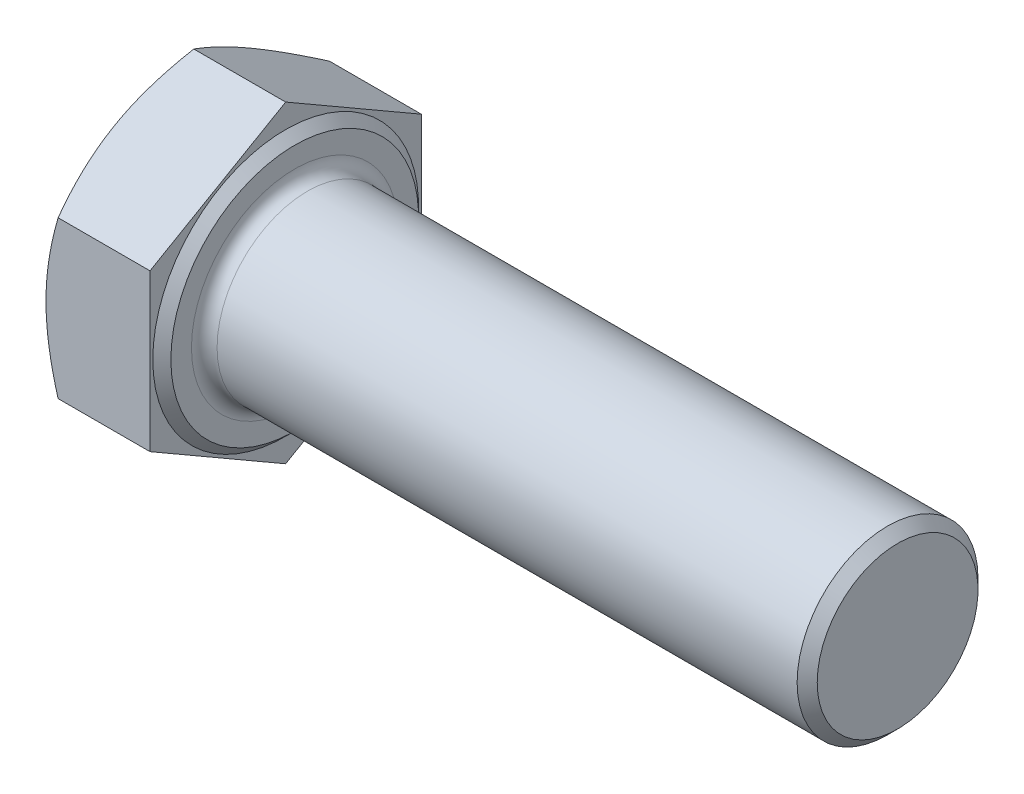
ISO-10303-21;
HEADER;
FILE_DESCRIPTION(('STEP AP214'),'2;1');
FILE_NAME('part.step','',(''),(''),'','','');
FILE_SCHEMA(('AUTOMOTIVE_DESIGN { 1 0 10303 214 1 1 1 1 }'));
ENDSEC;
DATA;
#1=APPLICATION_CONTEXT('core data for automotive mechanical design processes');
#2=APPLICATION_PROTOCOL_DEFINITION('international standard','automotive_design',2000,#1);
#3=PRODUCT_CONTEXT('',#1,'mechanical');
#4=PRODUCT('Part','Part','',(#3));
#5=PRODUCT_RELATED_PRODUCT_CATEGORY('part','',(#4));
#6=PRODUCT_DEFINITION_FORMATION('','',#4);
#7=PRODUCT_DEFINITION_CONTEXT('part definition',#1,'design');
#8=PRODUCT_DEFINITION('design','',#6,#7);
#9=PRODUCT_DEFINITION_SHAPE('','',#8);
#10=(LENGTH_UNIT() NAMED_UNIT(*) SI_UNIT(.MILLI.,.METRE.));
#11=(NAMED_UNIT(*) PLANE_ANGLE_UNIT() SI_UNIT($,.RADIAN.));
#12=(NAMED_UNIT(*) SI_UNIT($,.STERADIAN.) SOLID_ANGLE_UNIT());
#13=UNCERTAINTY_MEASURE_WITH_UNIT(LENGTH_MEASURE(1.E-05),#10,'distance_accuracy_value','');
#14=(GEOMETRIC_REPRESENTATION_CONTEXT(3) GLOBAL_UNCERTAINTY_ASSIGNED_CONTEXT((#13)) GLOBAL_UNIT_ASSIGNED_CONTEXT((#10,
#11,#12)) REPRESENTATION_CONTEXT('',''));
#15=CARTESIAN_POINT('',(0.,0.,0.));
#16=DIRECTION('',(0.,0.,1.));
#17=DIRECTION('',(1.,0.,0.));
#18=AXIS2_PLACEMENT_3D('',#15,#16,#17);
#19=CARTESIAN_POINT('',(7.5,5.19615242270662,-9.00000000000001));
#20=DIRECTION('',(1.,0.,0.));
#21=DIRECTION('',(0.,0.,-1.));
#22=AXIS2_PLACEMENT_3D('',#19,#20,#21);
#23=PLANE('',#22);
#24=CARTESIAN_POINT('',(7.5,0.,0.));
#25=DIRECTION('',(-1.,0.,0.));
#26=DIRECTION('',(0.,0.,1.));
#27=AXIS2_PLACEMENT_3D('',#24,#25,#26);
#28=CIRCLE('',#27,6.85);
#29=CARTESIAN_POINT('',(7.5,0.,6.85));
#30=VERTEX_POINT('',#29);
#31=EDGE_CURVE('E172',#30,#30,#28,.T.);
#32=ORIENTED_EDGE('',*,*,#31,.T.);
#33=EDGE_LOOP('',(#32));
#34=FACE_BOUND('',#33,.T.);
#35=CARTESIAN_POINT('',(7.5,0.,0.));
#36=DIRECTION('',(-1.,0.,0.));
#37=DIRECTION('',(0.,0.,1.));
#38=AXIS2_PLACEMENT_3D('',#35,#36,#37);
#39=CIRCLE('',#38,8.215);
#40=CARTESIAN_POINT('',(7.5,0.,8.215));
#41=VERTEX_POINT('',#40);
#42=EDGE_CURVE('E253',#41,#41,#39,.T.);
#43=ORIENTED_EDGE('',*,*,#42,.F.);
#44=EDGE_LOOP('',(#43));
#45=FACE_BOUND('',#44,.T.);
#46=ADVANCED_FACE('F36',(#34,#45),#23,.T.);
#47=CARTESIAN_POINT('',(8.35,0.,0.));
#48=DIRECTION('',(-1.,0.,0.));
#49=DIRECTION('',(0.,0.,1.));
#50=AXIS2_PLACEMENT_3D('',#47,#48,#49);
#51=TOROIDAL_SURFACE('',#50,6.85,0.85);
#52=ORIENTED_EDGE('',*,*,#31,.F.);
#53=EDGE_LOOP('',(#52));
#54=FACE_BOUND('',#53,.T.);
#55=CARTESIAN_POINT('',(8.35,0.,0.));
#56=DIRECTION('',(-1.,0.,0.));
#57=DIRECTION('',(0.,0.,1.));
#58=AXIS2_PLACEMENT_3D('',#55,#56,#57);
#59=CIRCLE('',#58,6.);
#60=CARTESIAN_POINT('',(8.35,0.,6.));
#61=VERTEX_POINT('',#60);
#62=EDGE_CURVE('E120',#61,#61,#59,.T.);
#63=ORIENTED_EDGE('',*,*,#62,.T.);
#64=EDGE_LOOP('',(#63));
#65=FACE_BOUND('',#64,.T.);
#66=ADVANCED_FACE('F207',(#54,#65),#51,.F.);
#67=CARTESIAN_POINT('',(47.5,6.,0.));
#68=DIRECTION('',(-1.,0.,0.));
#69=DIRECTION('',(0.,0.,1.));
#70=AXIS2_PLACEMENT_3D('',#67,#68,#69);
#71=PLANE('',#70);
#72=CARTESIAN_POINT('',(47.5,0.,0.));
#73=DIRECTION('',(-1.,0.,0.));
#74=DIRECTION('',(0.,0.,1.));
#75=AXIS2_PLACEMENT_3D('',#72,#73,#74);
#76=CIRCLE('',#75,5.33333333333333);
#77=CARTESIAN_POINT('',(47.5,0.,5.33333333333333));
#78=VERTEX_POINT('',#77);
#79=EDGE_CURVE('E44',#78,#78,#76,.F.);
#80=ORIENTED_EDGE('',*,*,#79,.T.);
#81=EDGE_LOOP('',(#80));
#82=FACE_BOUND('',#81,.T.);
#83=ADVANCED_FACE('F159',(#82),#71,.F.);
#84=CARTESIAN_POINT('',(7.50000000000001,0.,0.));
#85=DIRECTION('',(-1.,0.,0.));
#86=DIRECTION('',(0.,0.,1.));
#87=AXIS2_PLACEMENT_3D('',#84,#85,#86);
#88=CYLINDRICAL_SURFACE('',#87,6.);
#89=CARTESIAN_POINT('',(46.8333333333333,0.,0.));
#90=DIRECTION('',(-1.,0.,0.));
#91=DIRECTION('',(0.,0.,1.));
#92=AXIS2_PLACEMENT_3D('',#89,#90,#91);
#93=CIRCLE('',#92,6.);
#94=CARTESIAN_POINT('',(46.8333333333333,0.,6.));
#95=VERTEX_POINT('',#94);
#96=EDGE_CURVE('E154',#95,#95,#93,.T.);
#97=ORIENTED_EDGE('',*,*,#96,.T.);
#98=EDGE_LOOP('',(#97));
#99=FACE_BOUND('',#98,.T.);
#100=ORIENTED_EDGE('',*,*,#62,.F.);
#101=EDGE_LOOP('',(#100));
#102=FACE_BOUND('',#101,.T.);
#103=ADVANCED_FACE('F163',(#99,#102),#88,.T.);
#104=CARTESIAN_POINT('',(46.8333333333333,0.,0.));
#105=DIRECTION('',(-1.,0.,0.));
#106=DIRECTION('',(0.,0.,1.));
#107=AXIS2_PLACEMENT_3D('',#104,#105,#106);
#108=CONICAL_SURFACE('',#107,6.,0.785398163397448);
#109=ORIENTED_EDGE('',*,*,#79,.F.);
#110=EDGE_LOOP('',(#109));
#111=FACE_BOUND('',#110,.T.);
#112=ORIENTED_EDGE('',*,*,#96,.F.);
#113=EDGE_LOOP('',(#112));
#114=FACE_BOUND('',#113,.T.);
#115=ADVANCED_FACE('F38',(#111,#114),#108,.T.);
#116=CARTESIAN_POINT('',(6.9,-8.815,0.));
#117=DIRECTION('',(1.,0.,0.));
#118=DIRECTION('',(0.,0.,-1.));
#119=AXIS2_PLACEMENT_3D('',#116,#117,#118);
#120=PLANE('',#119);
#121=CARTESIAN_POINT('',(6.9,0.,0.));
#122=DIRECTION('',(-1.,0.,0.));
#123=DIRECTION('',(0.,0.,1.));
#124=AXIS2_PLACEMENT_3D('',#121,#122,#123);
#125=CIRCLE('',#124,8.815);
#126=CARTESIAN_POINT('',(6.9,0.,8.815));
#127=VERTEX_POINT('',#126);
#128=EDGE_CURVE('E255',#127,#127,#125,.T.);
#129=ORIENTED_EDGE('',*,*,#128,.T.);
#130=EDGE_LOOP('',(#129));
#131=FACE_BOUND('',#130,.T.);
#132=DIRECTION('',(0.,1.,0.));
#133=VECTOR('',#132,1.);
#134=CARTESIAN_POINT('',(6.9,-5.19615242270667,-9.00000000000001));
#135=LINE('',#134,#133);
#136=CARTESIAN_POINT('',(6.9,-5.19615242270667,-9.00000000000001));
#137=VERTEX_POINT('',#136);
#138=CARTESIAN_POINT('',(6.9,5.19615242270662,-9.00000000000001));
#139=VERTEX_POINT('',#138);
#140=EDGE_CURVE('E107',#137,#139,#135,.T.);
#141=ORIENTED_EDGE('',*,*,#140,.T.);
#142=DIRECTION('',(0.,0.500000000000001,0.866025403784438));
#143=VECTOR('',#142,1.);
#144=CARTESIAN_POINT('',(6.9,5.19615242270662,-9.00000000000001));
#145=LINE('',#144,#143);
#146=CARTESIAN_POINT('',(6.9,10.3923048454133,0.));
#147=VERTEX_POINT('',#146);
#148=EDGE_CURVE('E121',#139,#147,#145,.T.);
#149=ORIENTED_EDGE('',*,*,#148,.T.);
#150=DIRECTION('',(0.,-0.5,0.866025403784439));
#151=VECTOR('',#150,1.);
#152=CARTESIAN_POINT('',(6.9,10.3923048454133,0.));
#153=LINE('',#152,#151);
#154=CARTESIAN_POINT('',(6.9,5.19615242270664,9.00000000000001));
#155=VERTEX_POINT('',#154);
#156=EDGE_CURVE('E263',#147,#155,#153,.T.);
#157=ORIENTED_EDGE('',*,*,#156,.T.);
#158=DIRECTION('',(0.,-1.,0.));
#159=VECTOR('',#158,1.);
#160=CARTESIAN_POINT('',(6.9,5.19615242270664,9.00000000000001));
#161=LINE('',#160,#159);
#162=CARTESIAN_POINT('',(6.9,-5.19615242270665,9.00000000000001));
#163=VERTEX_POINT('',#162);
#164=EDGE_CURVE('E261',#155,#163,#161,.T.);
#165=ORIENTED_EDGE('',*,*,#164,.T.);
#166=DIRECTION('',(0.,-0.5,-0.866025403784439));
#167=VECTOR('',#166,1.);
#168=CARTESIAN_POINT('',(6.9,-5.19615242270665,9.00000000000001));
#169=LINE('',#168,#167);
#170=CARTESIAN_POINT('',(6.9,-10.3923048454133,0.));
#171=VERTEX_POINT('',#170);
#172=EDGE_CURVE('E50',#163,#171,#169,.T.);
#173=ORIENTED_EDGE('',*,*,#172,.T.);
#174=DIRECTION('',(0.,0.499999999999999,-0.866025403784439));
#175=VECTOR('',#174,1.);
#176=CARTESIAN_POINT('',(6.9,-10.3923048454133,0.));
#177=LINE('',#176,#175);
#178=EDGE_CURVE('E11',#171,#137,#177,.T.);
#179=ORIENTED_EDGE('',*,*,#178,.T.);
#180=EDGE_LOOP('',(#141,#149,#157,#165,#173,#179));
#181=FACE_BOUND('',#180,.T.);
#182=ADVANCED_FACE('F106',(#131,#181),#120,.T.);
#183=CARTESIAN_POINT('',(6.9,0.,0.));
#184=DIRECTION('',(-1.,0.,0.));
#185=DIRECTION('',(0.,0.,1.));
#186=AXIS2_PLACEMENT_3D('',#183,#184,#185);
#187=CONICAL_SURFACE('',#186,8.815,0.785398163397445);
#188=ORIENTED_EDGE('',*,*,#42,.T.);
#189=EDGE_LOOP('',(#188));
#190=FACE_BOUND('',#189,.T.);
#191=ORIENTED_EDGE('',*,*,#128,.F.);
#192=EDGE_LOOP('',(#191));
#193=FACE_BOUND('',#192,.T.);
#194=ADVANCED_FACE('F327',(#190,#193),#187,.T.);
#195=CARTESIAN_POINT('',(0.,5.19615242270662,-9.00000000000001));
#196=DIRECTION('',(1.,0.,0.));
#197=DIRECTION('',(0.,0.,-1.));
#198=AXIS2_PLACEMENT_3D('',#195,#196,#197);
#199=PLANE('',#198);
#200=CARTESIAN_POINT('',(0.,0.,0.));
#201=DIRECTION('',(1.,0.,0.));
#202=DIRECTION('',(0.,0.,-1.));
#203=AXIS2_PLACEMENT_3D('',#200,#201,#202);
#204=CIRCLE('',#203,9.);
#205=CARTESIAN_POINT('',(0.,0.,-9.));
#206=VERTEX_POINT('',#205);
#207=CARTESIAN_POINT('',(0.,7.79422863405995,-4.50000000000001));
#208=VERTEX_POINT('',#207);
#209=EDGE_CURVE('E153',#206,#208,#204,.T.);
#210=ORIENTED_EDGE('',*,*,#209,.F.);
#211=CARTESIAN_POINT('',(0.,-7.79422863405998,-4.50000000000001));
#212=VERTEX_POINT('',#211);
#213=EDGE_CURVE('E149',#212,#206,#204,.T.);
#214=ORIENTED_EDGE('',*,*,#213,.F.);
#215=CARTESIAN_POINT('',(0.,-7.79422863405995,4.5));
#216=VERTEX_POINT('',#215);
#217=EDGE_CURVE('E152',#216,#212,#204,.T.);
#218=ORIENTED_EDGE('',*,*,#217,.F.);
#219=CARTESIAN_POINT('',(0.,0.,9.));
#220=VERTEX_POINT('',#219);
#221=EDGE_CURVE('E292',#220,#216,#204,.T.);
#222=ORIENTED_EDGE('',*,*,#221,.F.);
#223=CARTESIAN_POINT('',(0.,0.,0.));
#224=DIRECTION('',(-1.,0.,0.));
#225=DIRECTION('',(0.,0.,1.));
#226=AXIS2_PLACEMENT_3D('',#223,#224,#225);
#227=CIRCLE('',#226,9.);
#228=CARTESIAN_POINT('',(0.,7.79422863405995,4.5));
#229=VERTEX_POINT('',#228);
#230=EDGE_CURVE('E175',#220,#229,#227,.T.);
#231=ORIENTED_EDGE('',*,*,#230,.T.);
#232=EDGE_CURVE('E329',#208,#229,#204,.T.);
#233=ORIENTED_EDGE('',*,*,#232,.F.);
#234=EDGE_LOOP('',(#210,#214,#218,#222,#231,#233));
#235=FACE_BOUND('',#234,.T.);
#236=ADVANCED_FACE('F321',(#235),#199,.F.);
#237=CARTESIAN_POINT('',(0.,0.,0.));
#238=DIRECTION('',(1.,0.,0.));
#239=DIRECTION('',(0.,0.,1.));
#240=AXIS2_PLACEMENT_3D('',#237,#238,#239);
#241=CONICAL_SURFACE('',#240,9.,1.0471975511966);
#242=CARTESIAN_POINT('',(0.803914245071134,10.3924203154671,0.000200000000000748));
#243=CARTESIAN_POINT('',(0.737982001874056,10.2782163639798,-0.197607046401217));
#244=CARTESIAN_POINT('',(0.675041409210313,10.1635669787649,-0.396185606649945));
#245=CARTESIAN_POINT('',(0.555968997655537,9.93333715083391,-0.79495536604421));
#246=CARTESIAN_POINT('',(0.499840117752063,9.81775632901308,-0.995147221818451));
#247=CARTESIAN_POINT('',(0.395151960728963,9.58544915100228,-1.3975150570961));
#248=CARTESIAN_POINT('',(0.346610772912786,9.46872074181186,-1.5996945925006));
#249=CARTESIAN_POINT('',(0.258148516787921,9.23447001335913,-2.00542875589075));
#250=CARTESIAN_POINT('',(0.218225687483275,9.11694786135375,-2.20898309417891));
#251=CARTESIAN_POINT('',(0.148684674147116,8.88408932604662,-2.61230590830692));
#252=CARTESIAN_POINT('',(0.1188375028478,8.76877014301847,-2.812044592399));
#253=CARTESIAN_POINT('',(0.0687933098590818,8.53761579013205,-3.212415675989));
#254=CARTESIAN_POINT('',(0.0485954355375401,8.42178066677662,-3.41304799494161));
#255=CARTESIAN_POINT('',(0.0183543473973479,8.18990950036672,-3.81466063597382));
#256=CARTESIAN_POINT('',(0.00829960958430425,8.07387383570154,-4.01564030266394));
#257=CARTESIAN_POINT('',(-0.0014376648549169,7.84169571742974,-4.41778459991642));
#258=CARTESIAN_POINT('',(-0.0011205219352435,7.72555326723328,-4.61894922457222));
#259=CARTESIAN_POINT('',(0.00916395215317316,7.50842142195782,-4.9950326125305));
#260=CARTESIAN_POINT('',(0.0178767400303971,7.40741671639994,-5.16997789436029));
#261=CARTESIAN_POINT('',(0.0429773400653699,7.20564389241818,-5.51945867708335));
#262=CARTESIAN_POINT('',(0.0593656695806695,7.10487579040239,-5.69399414955697));
#263=CARTESIAN_POINT('',(0.11965655623583,6.8029615939808,-6.21692487728551));
#264=CARTESIAN_POINT('',(0.174677482341129,6.60234990505054,-6.56439451510492));
#265=CARTESIAN_POINT('',(0.312230476325152,6.1989985076226,-7.26301962875401));
#266=CARTESIAN_POINT('',(0.395345618627108,5.99631027619253,-7.61408594368718));
#267=CARTESIAN_POINT('',(0.583982539436463,5.59395639760763,-8.31098330401862));
#268=CARTESIAN_POINT('',(0.689460012893358,5.39428559809852,-8.65682327355629));
#269=CARTESIAN_POINT('',(0.803914245071134,5.19603695265278,-9.00020000000002));
#270=B_SPLINE_CURVE_WITH_KNOTS('',3,(#242,#243,#244,#245,#246,#247,#248,#249,#250,#251,#252,
#253,#254,#255,#256,#257,#258,#259,#260,#261,#262,#263,#264,#265,#266,#267,#268,#269),
.UNSPECIFIED.,.F.,.F.,(4,2,2,2,2,2,2,2,2,2,2,2,2,4),(0.,0.713219249102578,1.42674513853509,
2.14194697262263,2.85700253034481,3.55449749123034,4.25193080859215,4.94857085059645,
5.64518936892663,6.25162976378285,6.85811104066342,8.07193747617895,9.31268391793543,
10.5509947443908),.UNSPECIFIED.);
#271=CARTESIAN_POINT('',(0.803847577293368,5.19615242270662,-9.00000000000001));
#272=VERTEX_POINT('',#271);
#273=EDGE_CURVE('E226',#208,#272,#270,.T.);
#274=ORIENTED_EDGE('',*,*,#273,.T.);
#275=CARTESIAN_POINT('',(4.3157074191982,-13.7995084316843,-9.));
#276=CARTESIAN_POINT('',(4.22013253439526,-13.6018679254426,-9.));
#277=CARTESIAN_POINT('',(4.12505080298443,-13.4039890546484,-9.));
#278=CARTESIAN_POINT('',(3.93598680428893,-13.0077042464045,-9.));
#279=CARTESIAN_POINT('',(3.84200454898896,-12.8092983032384,-9.));
#280=CARTESIAN_POINT('',(3.56184962780383,-12.2131565216176,-9.));
#281=CARTESIAN_POINT('',(3.37749981033902,-11.8145606598045,-9.00000000000001));
#282=CARTESIAN_POINT('',(3.01379661311235,-11.0123492685397,-9.00000000000001));
#283=CARTESIAN_POINT('',(2.8344776887473,-10.6087180782901,-9.00000000000001));
#284=CARTESIAN_POINT('',(2.48351230837535,-9.79814577003558,-9.00000000000001));
#285=CARTESIAN_POINT('',(2.31186545400594,-9.39120482518532,-9.00000000000001));
#286=CARTESIAN_POINT('',(1.9762152821863,-8.56822658898829,-9.00000000000001));
#287=CARTESIAN_POINT('',(1.81233420517801,-8.15213916672017,-9.00000000000001));
#288=CARTESIAN_POINT('',(1.49736059333087,-7.31506428892379,-9.00000000000001));
#289=CARTESIAN_POINT('',(1.3462694790236,-6.89407629499924,-9.00000000000001));
#290=CARTESIAN_POINT('',(1.06092289616766,-6.04738374465275,-9.00000000000001));
#291=CARTESIAN_POINT('',(0.926631795715649,-5.62169132879654,-9.00000000000001));
#292=CARTESIAN_POINT('',(0.679232315760683,-4.76426914600716,-9.00000000000001));
#293=CARTESIAN_POINT('',(0.566117256449574,-4.33254132922887,-9.00000000000001));
#294=CARTESIAN_POINT('',(0.366559377115363,-3.46268902797104,-9.00000000000001));
#295=CARTESIAN_POINT('',(0.280122671254115,-3.02456310122821,-9.00000000000001));
#296=CARTESIAN_POINT('',(0.174793560541782,-2.36350316664865,-9.00000000000001));
#297=CARTESIAN_POINT('',(0.143735891512435,-2.14247764841096,-9.00000000000001));
#298=CARTESIAN_POINT('',(0.0903399537533509,-1.69938384805887,-9.00000000000001));
#299=CARTESIAN_POINT('',(0.0680008209790058,-1.47731567148507,-9.00000000000001));
#300=CARTESIAN_POINT('',(0.0326440618616337,-1.03385615589218,-9.00000000000001));
#301=CARTESIAN_POINT('',(0.0195680807765648,-0.812469488475633,-9.00000000000001));
#302=CARTESIAN_POINT('',(0.00280703600105557,-0.369341048257121,-9.00000000000001));
#303=CARTESIAN_POINT('',(-0.000878151660751399,-0.147599280181647,-9.00000000000001));
#304=CARTESIAN_POINT('',(0.00123027624060716,0.295777195751507,-9.00000000000001));
#305=CARTESIAN_POINT('',(0.00702120862283877,0.517411916146251,-9.00000000000001));
#306=CARTESIAN_POINT('',(0.027937345948715,0.960243673240963,-9.00000000000001));
#307=CARTESIAN_POINT('',(0.0430630239651761,1.18144068718854,-9.00000000000001));
#308=CARTESIAN_POINT('',(0.0906660893200386,1.71695975867394,-9.00000000000001));
#309=CARTESIAN_POINT('',(0.127787316423487,2.0308758167705,-9.00000000000001));
#310=CARTESIAN_POINT('',(0.218774280130696,2.6563149667132,-9.00000000000001));
#311=CARTESIAN_POINT('',(0.272644573172931,2.96783738373058,-9.00000000000001));
#312=CARTESIAN_POINT('',(0.395219259557939,3.58822803653578,-9.00000000000001));
#313=CARTESIAN_POINT('',(0.463937632650046,3.89709348380463,-9.00000000000001));
#314=CARTESIAN_POINT('',(0.614110733174985,4.51165246111965,-9.00000000000001));
#315=CARTESIAN_POINT('',(0.69556426298213,4.81734628654834,-9.00000000000001));
#316=CARTESIAN_POINT('',(0.871394352716579,5.43311669104529,-9.00000000000001));
#317=CARTESIAN_POINT('',(0.966039586729744,5.74311602048119,-9.00000000000001));
#318=CARTESIAN_POINT('',(1.1647210228455,6.35983838148364,-9.00000000000001));
#319=CARTESIAN_POINT('',(1.26875076248434,6.66656350743331,-9.00000000000002));
#320=CARTESIAN_POINT('',(1.48404906939514,7.27550705154941,-9.00000000000002));
#321=CARTESIAN_POINT('',(1.59527366551665,7.57774111009036,-9.00000000000002));
#322=CARTESIAN_POINT('',(1.82427658147772,8.17986095918019,-9.00000000000002));
#323=CARTESIAN_POINT('',(1.94205753444496,8.47974575026465,-9.00000000000002));
#324=CARTESIAN_POINT('',(2.06246896276842,8.77853935760543,-9.00000000000002));
#325=B_SPLINE_CURVE_WITH_KNOTS('',3,(#275,#276,#277,#278,#279,#280,#281,#282,#283,#284,#285,
#286,#287,#288,#289,#290,#291,#292,#293,#294,#295,#296,#297,#298,#299,#300,#301,#302,#303,#304,
#305,#306,#307,#308,#309,#310,#311,#312,#313,#314,#315,#316,#317,#318,#319,#320,#321,#322,#323,
#324),.UNSPECIFIED.,.F.,.F.,(4,2,2,2,2,2,2,2,2,2,2,2,2,2,2,2,2,2,2,2,2,2,2,2,4),(0.,
0.65860859564293,1.31722436368957,2.63466903722827,3.959620579505,5.28450324524448,
6.62593322236619,7.96751199196909,9.30619528594504,10.6444555891149,11.9830223682758,
12.6524681090957,13.3218474880934,13.9869715718367,14.6520868749835,15.3170138820864,
15.9819745895962,16.929756693784,17.877796859826,18.8267335436614,19.7755810422467,
20.747776571344,21.719307653667,22.6853783589894,23.6518398914796),.UNSPECIFIED.);
#326=EDGE_CURVE('E281',#272,#206,#325,.F.);
#327=ORIENTED_EDGE('',*,*,#326,.T.);
#328=ORIENTED_EDGE('',*,*,#209,.T.);
#329=EDGE_LOOP('',(#274,#327,#328));
#330=FACE_BOUND('',#329,.T.);
#331=ADVANCED_FACE('F317',(#330),#241,.T.);
#332=CARTESIAN_POINT('',(0.803914245071135,5.1960369526528,9.0002));
#333=CARTESIAN_POINT('',(0.737982001874056,5.31024090414015,8.80239295359879));
#334=CARTESIAN_POINT('',(0.675041409210313,5.42489028935504,8.60381439335006));
#335=CARTESIAN_POINT('',(0.555968997655538,5.65512011728601,8.20504463395579));
#336=CARTESIAN_POINT('',(0.499840117752065,5.77070093910683,8.00485277818155));
#337=CARTESIAN_POINT('',(0.395151960728965,6.00300811711763,7.60248494290391));
#338=CARTESIAN_POINT('',(0.346610772912788,6.11973652630805,7.40030540749941));
#339=CARTESIAN_POINT('',(0.258148516787922,6.35398725476078,6.99457124410926));
#340=CARTESIAN_POINT('',(0.218225687483276,6.47150940676617,6.79101690582109));
#341=CARTESIAN_POINT('',(0.148684674147117,6.70436794207329,6.38769409169309));
#342=CARTESIAN_POINT('',(0.118837502847803,6.81968712510144,6.187955407601));
#343=CARTESIAN_POINT('',(0.0687933098590857,7.05084147798786,5.78758432401101));
#344=CARTESIAN_POINT('',(0.0485954355375437,7.16667660134329,5.58695200505839));
#345=CARTESIAN_POINT('',(0.0183543473973509,7.3985477677532,5.18533936402618));
#346=CARTESIAN_POINT('',(0.00829960958430697,7.51458343241838,4.98435969733606));
#347=CARTESIAN_POINT('',(-0.0014376648549136,7.74676155069017,4.58221540008358));
#348=CARTESIAN_POINT('',(-0.00112052193523936,7.86290400088663,4.38105077542778));
#349=CARTESIAN_POINT('',(0.00916395215317751,8.08003584616209,4.0049673874695));
#350=CARTESIAN_POINT('',(0.0178767400304009,8.18104055171997,3.83002210563971));
#351=CARTESIAN_POINT('',(0.0429773400653737,8.38281337570173,3.48054132291665));
#352=CARTESIAN_POINT('',(0.0593656695806736,8.48358147771751,3.30600585044303));
#353=CARTESIAN_POINT('',(0.119656556235835,8.78549567413911,2.7830751227145));
#354=CARTESIAN_POINT('',(0.174677482341133,8.98610736306937,2.43560548489509));
#355=CARTESIAN_POINT('',(0.312230476325155,9.3894587604973,1.736980371246));
#356=CARTESIAN_POINT('',(0.395345618627112,9.59214699192738,1.38591405631283));
#357=CARTESIAN_POINT('',(0.583982539436466,9.99450087051227,0.689016695981394));
#358=CARTESIAN_POINT('',(0.689460012893361,10.1941716700214,0.343176726443722));
#359=CARTESIAN_POINT('',(0.803914245071134,10.3924203154671,-0.000199999999999903));
#360=B_SPLINE_CURVE_WITH_KNOTS('',3,(#332,#333,#334,#335,#336,#337,#338,#339,#340,#341,#342,
#343,#344,#345,#346,#347,#348,#349,#350,#351,#352,#353,#354,#355,#356,#357,#358,#359),
.UNSPECIFIED.,.F.,.F.,(4,2,2,2,2,2,2,2,2,2,2,2,2,4),(0.,0.713219249102579,1.42674513853509,
2.14194697262263,2.85700253034481,3.55449749123034,4.25193080859215,4.94857085059646,
5.64518936892663,6.25162976378284,6.85811104066341,8.07193747617894,9.31268391793542,
10.5509947443908),.UNSPECIFIED.);
#361=CARTESIAN_POINT('',(0.803847577293369,10.3923048454133,0.));
#362=VERTEX_POINT('',#361);
#363=EDGE_CURVE('E133',#229,#362,#360,.T.);
#364=ORIENTED_EDGE('',*,*,#363,.T.);
#365=EDGE_CURVE('E58',#362,#208,#270,.T.);
#366=ORIENTED_EDGE('',*,*,#365,.T.);
#367=ORIENTED_EDGE('',*,*,#232,.T.);
#368=EDGE_LOOP('',(#364,#366,#367));
#369=FACE_BOUND('',#368,.T.);
#370=ADVANCED_FACE('F204',(#369),#241,.T.);
#371=CARTESIAN_POINT('',(0.803847577293369,5.19615242270664,9.00000000000001));
#372=VERTEX_POINT('',#371);
#373=EDGE_CURVE('E129',#372,#229,#360,.T.);
#374=ORIENTED_EDGE('',*,*,#373,.T.);
#375=ORIENTED_EDGE('',*,*,#230,.F.);
#376=CARTESIAN_POINT('',(4.3157074191982,-13.7995084316843,9.00000000000002));
#377=CARTESIAN_POINT('',(4.22013253439526,-13.6018679254426,9.00000000000002));
#378=CARTESIAN_POINT('',(4.12505080298442,-13.4039890546484,9.00000000000002));
#379=CARTESIAN_POINT('',(3.93598680428892,-13.0077042464044,9.00000000000002));
#380=CARTESIAN_POINT('',(3.84200454898896,-12.8092983032384,9.00000000000002));
#381=CARTESIAN_POINT('',(3.56184962780383,-12.2131565216176,9.00000000000002));
#382=CARTESIAN_POINT('',(3.37749981033902,-11.8145606598044,9.00000000000002));
#383=CARTESIAN_POINT('',(3.01379661311234,-11.0123492685397,9.00000000000002));
#384=CARTESIAN_POINT('',(2.8344776887473,-10.6087180782901,9.00000000000002));
#385=CARTESIAN_POINT('',(2.48351230837535,-9.79814577003556,9.00000000000002));
#386=CARTESIAN_POINT('',(2.31186545400594,-9.3912048251853,9.00000000000002));
#387=CARTESIAN_POINT('',(1.97621528218629,-8.56822658898827,9.00000000000002));
#388=CARTESIAN_POINT('',(1.81233420517801,-8.15213916672015,9.00000000000002));
#389=CARTESIAN_POINT('',(1.49736059333087,-7.31506428892377,9.00000000000002));
#390=CARTESIAN_POINT('',(1.3462694790236,-6.89407629499922,9.00000000000002));
#391=CARTESIAN_POINT('',(1.06092289616766,-6.04738374465273,9.00000000000002));
#392=CARTESIAN_POINT('',(0.926631795715647,-5.62169132879652,9.00000000000001));
#393=CARTESIAN_POINT('',(0.679232315760681,-4.76426914600714,9.00000000000001));
#394=CARTESIAN_POINT('',(0.566117256449572,-4.33254132922885,9.00000000000001));
#395=CARTESIAN_POINT('',(0.366559377115361,-3.46268902797102,9.00000000000001));
#396=CARTESIAN_POINT('',(0.280122671254114,-3.02456310122819,9.00000000000001));
#397=CARTESIAN_POINT('',(0.174793560541781,-2.36350316664863,9.00000000000001));
#398=CARTESIAN_POINT('',(0.143735891512434,-2.14247764841094,9.00000000000001));
#399=CARTESIAN_POINT('',(0.0903399537533499,-1.69938384805885,9.00000000000001));
#400=CARTESIAN_POINT('',(0.0680008209790052,-1.47731567148505,9.00000000000001));
#401=CARTESIAN_POINT('',(0.0326440618616327,-1.03385615589217,9.00000000000001));
#402=CARTESIAN_POINT('',(0.0195680807765631,-0.812469488475614,9.00000000000001));
#403=CARTESIAN_POINT('',(0.00280703600105437,-0.369341048257102,9.00000000000001));
#404=CARTESIAN_POINT('',(-0.000878151660751392,-0.147599280181627,9.00000000000001));
#405=CARTESIAN_POINT('',(0.00123027624060701,0.295777195751527,9.00000000000001));
#406=CARTESIAN_POINT('',(0.00702120862283722,0.517411916146271,9.00000000000001));
#407=CARTESIAN_POINT('',(0.0279373459487131,0.960243673240983,9.00000000000001));
#408=CARTESIAN_POINT('',(0.0430630239651753,1.18144068718856,9.00000000000001));
#409=CARTESIAN_POINT('',(0.0906660893200389,1.71695975867396,9.00000000000001));
#410=CARTESIAN_POINT('',(0.127787316423487,2.03087581677052,9.00000000000001));
#411=CARTESIAN_POINT('',(0.218774280130696,2.65631496671322,9.00000000000001));
#412=CARTESIAN_POINT('',(0.272644573172931,2.9678373837306,9.00000000000001));
#413=CARTESIAN_POINT('',(0.395219259557939,3.5882280365358,9.00000000000001));
#414=CARTESIAN_POINT('',(0.463937632650046,3.89709348380465,9.00000000000001));
#415=CARTESIAN_POINT('',(0.614110733174985,4.51165246111967,9.00000000000001));
#416=CARTESIAN_POINT('',(0.695564262982131,4.81734628654836,9.00000000000001));
#417=CARTESIAN_POINT('',(0.87139435271658,5.43311669104531,9.00000000000001));
#418=CARTESIAN_POINT('',(0.966039586729744,5.74311602048121,9.00000000000001));
#419=CARTESIAN_POINT('',(1.1647210228455,6.35983838148366,9.00000000000001));
#420=CARTESIAN_POINT('',(1.26875076248434,6.66656350743333,9.));
#421=CARTESIAN_POINT('',(1.48404906939514,7.27550705154943,9.));
#422=CARTESIAN_POINT('',(1.59527366551665,7.57774111009038,9.));
#423=CARTESIAN_POINT('',(1.82427658147773,8.17986095918021,9.));
#424=CARTESIAN_POINT('',(1.94205753444496,8.47974575026467,9.));
#425=CARTESIAN_POINT('',(2.06246896276842,8.77853935760545,9.));
#426=B_SPLINE_CURVE_WITH_KNOTS('',3,(#376,#377,#378,#379,#380,#381,#382,#383,#384,#385,#386,
#387,#388,#389,#390,#391,#392,#393,#394,#395,#396,#397,#398,#399,#400,#401,#402,#403,#404,#405,
#406,#407,#408,#409,#410,#411,#412,#413,#414,#415,#416,#417,#418,#419,#420,#421,#422,#423,#424,
#425),.UNSPECIFIED.,.F.,.F.,(4,2,2,2,2,2,2,2,2,2,2,2,2,2,2,2,2,2,2,2,2,2,2,2,4),(0.,
0.658608595642928,1.31722436368956,2.63466903722827,3.959620579505,5.28450324524448,
6.6259332223662,7.96751199196909,9.30619528594504,10.6444555891149,11.9830223682758,
12.6524681090957,13.3218474880934,13.9869715718367,14.6520868749835,15.3170138820864,
15.9819745895962,16.929756693784,17.877796859826,18.8267335436614,19.7755810422467,
20.747776571344,21.719307653667,22.6853783589894,23.6518398914796),.UNSPECIFIED.);
#427=EDGE_CURVE('E272',#220,#372,#426,.T.);
#428=ORIENTED_EDGE('',*,*,#427,.T.);
#429=EDGE_LOOP('',(#374,#375,#428));
#430=FACE_BOUND('',#429,.T.);
#431=ADVANCED_FACE('F198',(#430),#241,.T.);
#432=CARTESIAN_POINT('',(0.803847577293375,-5.19615242270665,9.00000000000001));
#433=VERTEX_POINT('',#432);
#434=EDGE_CURVE('E220',#433,#220,#426,.T.);
#435=ORIENTED_EDGE('',*,*,#434,.T.);
#436=ORIENTED_EDGE('',*,*,#221,.T.);
#437=CARTESIAN_POINT('',(0.803914245071145,-10.3924203154671,-0.000199999999998842));
#438=CARTESIAN_POINT('',(0.737982001874067,-10.2782163639798,0.197607046401218));
#439=CARTESIAN_POINT('',(0.675041409210325,-10.1635669787649,0.396185606649946));
#440=CARTESIAN_POINT('',(0.555968997655549,-9.93333715083393,0.794955366044212));
#441=CARTESIAN_POINT('',(0.499840117752075,-9.8177563290131,0.995147221818453));
#442=CARTESIAN_POINT('',(0.395151960728974,-9.5854491510023,1.3975150570961));
#443=CARTESIAN_POINT('',(0.346610772912797,-9.46872074181188,1.5996945925006));
#444=CARTESIAN_POINT('',(0.258148516787931,-9.23447001335915,2.00542875589075));
#445=CARTESIAN_POINT('',(0.218225687483285,-9.11694786135376,2.20898309417892));
#446=CARTESIAN_POINT('',(0.148684674147126,-8.88408932604664,2.61230590830692));
#447=CARTESIAN_POINT('',(0.118837502847811,-8.76877014301849,2.81204459239901));
#448=CARTESIAN_POINT('',(0.0687933098590938,-8.53761579013207,3.212415675989));
#449=CARTESIAN_POINT('',(0.0485954355375522,-8.42178066677664,3.41304799494162));
#450=CARTESIAN_POINT('',(0.0183543473973594,-8.18990950036673,3.81466063597383));
#451=CARTESIAN_POINT('',(0.00829960958431508,-8.07387383570155,4.01564030266395));
#452=CARTESIAN_POINT('',(-0.00143766485490569,-7.84169571742975,4.41778459991644));
#453=CARTESIAN_POINT('',(-0.00112052193523125,-7.7255532672333,4.61894922457224));
#454=CARTESIAN_POINT('',(0.00916395215318543,-7.50842142195784,4.99503261253052));
#455=CARTESIAN_POINT('',(0.0178767400304085,-7.40741671639995,5.16997789436031));
#456=CARTESIAN_POINT('',(0.0429773400653816,-7.2056438924182,5.51945867708336));
#457=CARTESIAN_POINT('',(0.0593656695806821,-7.10487579040241,5.69399414955699));
#458=CARTESIAN_POINT('',(0.119656556235844,-6.80296159398081,6.21692487728552));
#459=CARTESIAN_POINT('',(0.174677482341141,-6.60234990505056,6.56439451510493));
#460=CARTESIAN_POINT('',(0.312230476325162,-6.19899850762262,7.26301962875401));
#461=CARTESIAN_POINT('',(0.395345618627119,-5.99631027619255,7.61408594368719));
#462=CARTESIAN_POINT('',(0.583982539436473,-5.59395639760765,8.31098330401862));
#463=CARTESIAN_POINT('',(0.689460012893368,-5.39428559809855,8.65682327355629));
#464=CARTESIAN_POINT('',(0.803914245071142,-5.19603695265281,9.00020000000002));
#465=B_SPLINE_CURVE_WITH_KNOTS('',3,(#437,#438,#439,#440,#441,#442,#443,#444,#445,#446,#447,
#448,#449,#450,#451,#452,#453,#454,#455,#456,#457,#458,#459,#460,#461,#462,#463,#464),
.UNSPECIFIED.,.F.,.F.,(4,2,2,2,2,2,2,2,2,2,2,2,2,4),(0.,0.713219249102579,1.42674513853509,
2.14194697262263,2.85700253034481,3.55449749123035,4.25193080859216,4.94857085059647,
5.64518936892664,6.25162976378285,6.85811104066342,8.07193747617896,9.31268391793543,
10.5509947443908),.UNSPECIFIED.);
#466=EDGE_CURVE('E276',#216,#433,#465,.T.);
#467=ORIENTED_EDGE('',*,*,#466,.T.);
#468=EDGE_LOOP('',(#435,#436,#467));
#469=FACE_BOUND('',#468,.T.);
#470=ADVANCED_FACE('F203',(#469),#241,.T.);
#471=CARTESIAN_POINT('',(0.803847577293378,-5.19615242270667,-9.00000000000001));
#472=VERTEX_POINT('',#471);
#473=EDGE_CURVE('E214',#206,#472,#325,.F.);
#474=ORIENTED_EDGE('',*,*,#473,.T.);
#475=CARTESIAN_POINT('',(0.803914245071145,-5.19603695265283,-9.00020000000001));
#476=CARTESIAN_POINT('',(0.737982001874065,-5.31024090414018,-8.80239295359879));
#477=CARTESIAN_POINT('',(0.675041409210323,-5.42489028935507,-8.60381439335006));
#478=CARTESIAN_POINT('',(0.555968997655548,-5.65512011728603,-8.2050446339558));
#479=CARTESIAN_POINT('',(0.499840117752075,-5.77070093910686,-8.00485277818155));
#480=CARTESIAN_POINT('',(0.395151960728975,-6.00300811711766,-7.60248494290391));
#481=CARTESIAN_POINT('',(0.346610772912799,-6.11973652630808,-7.40030540749941));
#482=CARTESIAN_POINT('',(0.258148516787933,-6.35398725476081,-6.99457124410925));
#483=CARTESIAN_POINT('',(0.218225687483287,-6.4715094067662,-6.79101690582109));
#484=CARTESIAN_POINT('',(0.148684674147128,-6.70436794207332,-6.38769409169308));
#485=CARTESIAN_POINT('',(0.118837502847814,-6.81968712510147,-6.18795540760099));
#486=CARTESIAN_POINT('',(0.0687933098590958,-7.05084147798789,-5.787584324011));
#487=CARTESIAN_POINT('',(0.048595435537554,-7.16667660134332,-5.58695200505839));
#488=CARTESIAN_POINT('',(0.0183543473973617,-7.39854776775323,-5.18533936402618));
#489=CARTESIAN_POINT('',(0.00829960958431812,-7.51458343241841,-4.98435969733606));
#490=CARTESIAN_POINT('',(-0.00143766485490172,-7.7467615506902,-4.58221540008357));
#491=CARTESIAN_POINT('',(-0.00112052193522714,-7.86290400088666,-4.38105077542777));
#492=CARTESIAN_POINT('',(0.00916395215319027,-8.08003584616212,-4.00496738746949));
#493=CARTESIAN_POINT('',(0.0178767400304139,-8.18104055172,-3.8300221056397));
#494=CARTESIAN_POINT('',(0.0429773400653869,-8.38281337570176,-3.48054132291665));
#495=CARTESIAN_POINT('',(0.059365669580687,-8.48358147771754,-3.30600585044302));
#496=CARTESIAN_POINT('',(0.119656556235848,-8.78549567413913,-2.78307512271449));
#497=CARTESIAN_POINT('',(0.174677482341146,-8.98610736306939,-2.43560548489508));
#498=CARTESIAN_POINT('',(0.312230476325168,-9.38945876049732,-1.73698037124599));
#499=CARTESIAN_POINT('',(0.395345618627124,-9.5921469919274,-1.38591405631282));
#500=CARTESIAN_POINT('',(0.583982539436477,-9.99450087051229,-0.689016695981392));
#501=CARTESIAN_POINT('',(0.689460012893372,-10.1941716700214,-0.34317672644372));
#502=CARTESIAN_POINT('',(0.803914245071146,-10.3924203154671,0.000200000000001538));
#503=B_SPLINE_CURVE_WITH_KNOTS('',3,(#475,#476,#477,#478,#479,#480,#481,#482,#483,#484,#485,
#486,#487,#488,#489,#490,#491,#492,#493,#494,#495,#496,#497,#498,#499,#500,#501,#502),
.UNSPECIFIED.,.F.,.F.,(4,2,2,2,2,2,2,2,2,2,2,2,2,4),(0.,0.71321924910258,1.42674513853509,
2.14194697262264,2.85700253034481,3.55449749123035,4.25193080859216,4.94857085059647,
5.64518936892664,6.25162976378285,6.85811104066342,8.07193747617895,9.31268391793542,
10.5509947443908),.UNSPECIFIED.);
#504=EDGE_CURVE('E127',#472,#212,#503,.T.);
#505=ORIENTED_EDGE('',*,*,#504,.T.);
#506=ORIENTED_EDGE('',*,*,#213,.T.);
#507=EDGE_LOOP('',(#474,#505,#506));
#508=FACE_BOUND('',#507,.T.);
#509=ADVANCED_FACE('F287',(#508),#241,.T.);
#510=CARTESIAN_POINT('',(0.80384757729338,-10.3923048454133,0.));
#511=VERTEX_POINT('',#510);
#512=EDGE_CURVE('E189',#511,#216,#465,.T.);
#513=ORIENTED_EDGE('',*,*,#512,.T.);
#514=ORIENTED_EDGE('',*,*,#217,.T.);
#515=EDGE_CURVE('E181',#212,#511,#503,.T.);
#516=ORIENTED_EDGE('',*,*,#515,.T.);
#517=EDGE_LOOP('',(#513,#514,#516));
#518=FACE_BOUND('',#517,.T.);
#519=ADVANCED_FACE('F206',(#518),#241,.T.);
#520=CARTESIAN_POINT('',(7.5,-10.3923048454133,0.));
#521=DIRECTION('',(0.,0.866025403784439,0.499999999999999));
#522=DIRECTION('',(0.,-0.499999999999999,0.866025403784439));
#523=AXIS2_PLACEMENT_3D('',#520,#521,#522);
#524=PLANE('',#523);
#525=ORIENTED_EDGE('',*,*,#178,.F.);
#526=DIRECTION('',(-1.,0.,0.));
#527=VECTOR('',#526,1.);
#528=CARTESIAN_POINT('',(7.5,-10.3923048454133,0.));
#529=LINE('',#528,#527);
#530=EDGE_CURVE('E128',#171,#511,#529,.T.);
#531=ORIENTED_EDGE('',*,*,#530,.T.);
#532=ORIENTED_EDGE('',*,*,#515,.F.);
#533=ORIENTED_EDGE('',*,*,#504,.F.);
#534=DIRECTION('',(-1.,0.,0.));
#535=VECTOR('',#534,1.);
#536=CARTESIAN_POINT('',(7.5,-5.19615242270667,-9.00000000000001));
#537=LINE('',#536,#535);
#538=EDGE_CURVE('E116',#137,#472,#537,.T.);
#539=ORIENTED_EDGE('',*,*,#538,.F.);
#540=EDGE_LOOP('',(#525,#531,#532,#533,#539));
#541=FACE_BOUND('',#540,.T.);
#542=ADVANCED_FACE('F124',(#541),#524,.F.);
#543=CARTESIAN_POINT('',(7.5,-5.19615242270665,9.00000000000001));
#544=DIRECTION('',(0.,0.866025403784439,-0.5));
#545=DIRECTION('',(0.,0.5,0.866025403784439));
#546=AXIS2_PLACEMENT_3D('',#543,#544,#545);
#547=PLANE('',#546);
#548=ORIENTED_EDGE('',*,*,#172,.F.);
#549=DIRECTION('',(-1.,0.,0.));
#550=VECTOR('',#549,1.);
#551=CARTESIAN_POINT('',(7.5,-5.19615242270665,9.00000000000001));
#552=LINE('',#551,#550);
#553=EDGE_CURVE('E131',#163,#433,#552,.T.);
#554=ORIENTED_EDGE('',*,*,#553,.T.);
#555=ORIENTED_EDGE('',*,*,#466,.F.);
#556=ORIENTED_EDGE('',*,*,#512,.F.);
#557=ORIENTED_EDGE('',*,*,#530,.F.);
#558=EDGE_LOOP('',(#548,#554,#555,#556,#557));
#559=FACE_BOUND('',#558,.T.);
#560=ADVANCED_FACE('F294',(#559),#547,.F.);
#561=CARTESIAN_POINT('',(7.5,5.19615242270664,9.00000000000001));
#562=DIRECTION('',(0.,0.,-1.));
#563=DIRECTION('',(0.,1.,0.));
#564=AXIS2_PLACEMENT_3D('',#561,#562,#563);
#565=PLANE('',#564);
#566=ORIENTED_EDGE('',*,*,#164,.F.);
#567=DIRECTION('',(-1.,0.,0.));
#568=VECTOR('',#567,1.);
#569=CARTESIAN_POINT('',(7.5,5.19615242270664,9.00000000000001));
#570=LINE('',#569,#568);
#571=EDGE_CURVE('E144',#155,#372,#570,.T.);
#572=ORIENTED_EDGE('',*,*,#571,.T.);
#573=ORIENTED_EDGE('',*,*,#427,.F.);
#574=ORIENTED_EDGE('',*,*,#434,.F.);
#575=ORIENTED_EDGE('',*,*,#553,.F.);
#576=EDGE_LOOP('',(#566,#572,#573,#574,#575));
#577=FACE_BOUND('',#576,.T.);
#578=ADVANCED_FACE('F297',(#577),#565,.F.);
#579=CARTESIAN_POINT('',(7.5,10.3923048454133,0.));
#580=DIRECTION('',(0.,-0.866025403784439,-0.5));
#581=DIRECTION('',(0.,0.5,-0.866025403784439));
#582=AXIS2_PLACEMENT_3D('',#579,#580,#581);
#583=PLANE('',#582);
#584=ORIENTED_EDGE('',*,*,#156,.F.);
#585=DIRECTION('',(-1.,0.,0.));
#586=VECTOR('',#585,1.);
#587=CARTESIAN_POINT('',(7.5,10.3923048454133,0.));
#588=LINE('',#587,#586);
#589=EDGE_CURVE('E146',#147,#362,#588,.T.);
#590=ORIENTED_EDGE('',*,*,#589,.T.);
#591=ORIENTED_EDGE('',*,*,#363,.F.);
#592=ORIENTED_EDGE('',*,*,#373,.F.);
#593=ORIENTED_EDGE('',*,*,#571,.F.);
#594=EDGE_LOOP('',(#584,#590,#591,#592,#593));
#595=FACE_BOUND('',#594,.T.);
#596=ADVANCED_FACE('F236',(#595),#583,.F.);
#597=CARTESIAN_POINT('',(7.5,5.19615242270662,-9.00000000000001));
#598=DIRECTION('',(0.,-0.866025403784438,0.500000000000001));
#599=DIRECTION('',(0.,-0.500000000000001,-0.866025403784438));
#600=AXIS2_PLACEMENT_3D('',#597,#598,#599);
#601=PLANE('',#600);
#602=ORIENTED_EDGE('',*,*,#148,.F.);
#603=DIRECTION('',(-1.,0.,0.));
#604=VECTOR('',#603,1.);
#605=CARTESIAN_POINT('',(7.5,5.19615242270662,-9.00000000000001));
#606=LINE('',#605,#604);
#607=EDGE_CURVE('E119',#139,#272,#606,.T.);
#608=ORIENTED_EDGE('',*,*,#607,.T.);
#609=ORIENTED_EDGE('',*,*,#273,.F.);
#610=ORIENTED_EDGE('',*,*,#365,.F.);
#611=ORIENTED_EDGE('',*,*,#589,.F.);
#612=EDGE_LOOP('',(#602,#608,#609,#610,#611));
#613=FACE_BOUND('',#612,.T.);
#614=ADVANCED_FACE('F233',(#613),#601,.F.);
#615=CARTESIAN_POINT('',(7.5,-5.19615242270667,-9.00000000000001));
#616=DIRECTION('',(0.,0.,1.));
#617=DIRECTION('',(0.,-1.,0.));
#618=AXIS2_PLACEMENT_3D('',#615,#616,#617);
#619=PLANE('',#618);
#620=ORIENTED_EDGE('',*,*,#140,.F.);
#621=ORIENTED_EDGE('',*,*,#538,.T.);
#622=ORIENTED_EDGE('',*,*,#473,.F.);
#623=ORIENTED_EDGE('',*,*,#326,.F.);
#624=ORIENTED_EDGE('',*,*,#607,.F.);
#625=EDGE_LOOP('',(#620,#621,#622,#623,#624));
#626=FACE_BOUND('',#625,.T.);
#627=ADVANCED_FACE('F114',(#626),#619,.F.);
#628=CLOSED_SHELL('',(#46,#66,#83,#103,#115,#182,#194,#236,#331,#370,#431,#470,#509,#519,#542,
#560,#578,#596,#614,#627));
#629=MANIFOLD_SOLID_BREP('B2',#628);
#630=ADVANCED_BREP_SHAPE_REPRESENTATION('',(#18,#629),#14);
#631=SHAPE_DEFINITION_REPRESENTATION(#9,#630);
ENDSEC;
END-ISO-10303-21;
